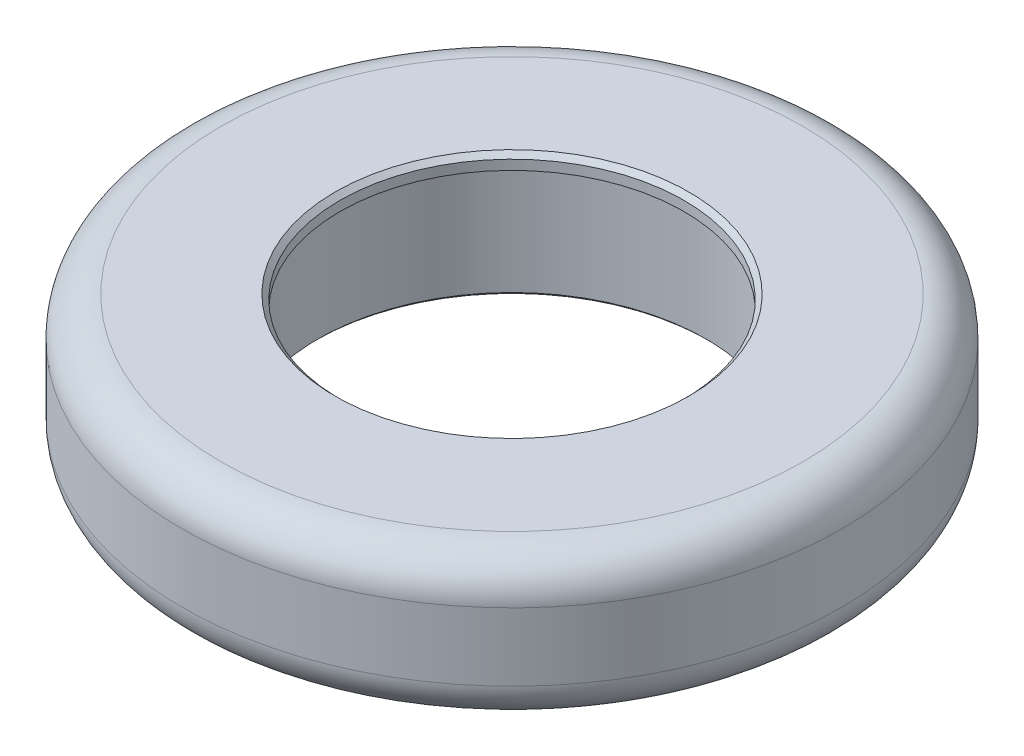
ISO-10303-21;
HEADER;
FILE_DESCRIPTION(('STEP AP214'),'2;1');
FILE_NAME('part.step','',(''),(''),'','','');
FILE_SCHEMA(('AUTOMOTIVE_DESIGN { 1 0 10303 214 1 1 1 1 }'));
ENDSEC;
DATA;
#1=APPLICATION_CONTEXT('core data for automotive mechanical design processes');
#2=APPLICATION_PROTOCOL_DEFINITION('international standard','automotive_design',2000,#1);
#3=PRODUCT_CONTEXT('',#1,'mechanical');
#4=PRODUCT('Part','Part','',(#3));
#5=PRODUCT_RELATED_PRODUCT_CATEGORY('part','',(#4));
#6=PRODUCT_DEFINITION_FORMATION('','',#4);
#7=PRODUCT_DEFINITION_CONTEXT('part definition',#1,'design');
#8=PRODUCT_DEFINITION('design','',#6,#7);
#9=PRODUCT_DEFINITION_SHAPE('','',#8);
#10=(LENGTH_UNIT() NAMED_UNIT(*) SI_UNIT(.MILLI.,.METRE.));
#11=(NAMED_UNIT(*) PLANE_ANGLE_UNIT() SI_UNIT($,.RADIAN.));
#12=(NAMED_UNIT(*) SI_UNIT($,.STERADIAN.) SOLID_ANGLE_UNIT());
#13=UNCERTAINTY_MEASURE_WITH_UNIT(LENGTH_MEASURE(1.E-05),#10,'distance_accuracy_value','');
#14=(GEOMETRIC_REPRESENTATION_CONTEXT(3) GLOBAL_UNCERTAINTY_ASSIGNED_CONTEXT((#13)) GLOBAL_UNIT_ASSIGNED_CONTEXT((#10,
#11,#12)) REPRESENTATION_CONTEXT('',''));
#15=CARTESIAN_POINT('',(0.,0.,0.));
#16=DIRECTION('',(0.,0.,1.));
#17=DIRECTION('',(1.,0.,0.));
#18=AXIS2_PLACEMENT_3D('',#15,#16,#17);
#19=CARTESIAN_POINT('',(-17.75,-19.1656552052698,0.));
#20=DIRECTION('',(0.,1.,0.));
#21=DIRECTION('',(-1.,0.,0.));
#22=AXIS2_PLACEMENT_3D('',#19,#20,#21);
#23=PLANE('',#22);
#24=CARTESIAN_POINT('',(0.,-19.1656552052698,0.));
#25=DIRECTION('',(0.,1.,0.));
#26=DIRECTION('',(-1.,0.,0.));
#27=AXIS2_PLACEMENT_3D('',#24,#25,#26);
#28=CIRCLE('',#27,18.25);
#29=CARTESIAN_POINT('',(-18.25,-19.1656552052698,0.));
#30=VERTEX_POINT('',#29);
#31=EDGE_CURVE('E65',#30,#30,#28,.F.);
#32=ORIENTED_EDGE('',*,*,#31,.T.);
#33=EDGE_LOOP('',(#32));
#34=FACE_BOUND('',#33,.T.);
#35=CARTESIAN_POINT('',(0.,-19.1656552052698,0.));
#36=DIRECTION('',(0.,1.,0.));
#37=DIRECTION('',(-1.,0.,0.));
#38=AXIS2_PLACEMENT_3D('',#35,#36,#37);
#39=CIRCLE('',#38,30.);
#40=CARTESIAN_POINT('',(-30.,-19.1656552052698,0.));
#41=VERTEX_POINT('',#40);
#42=EDGE_CURVE('E80',#41,#41,#39,.T.);
#43=ORIENTED_EDGE('',*,*,#42,.T.);
#44=EDGE_LOOP('',(#43));
#45=FACE_BOUND('',#44,.T.);
#46=ADVANCED_FACE('F45',(#34,#45),#23,.T.);
#47=CARTESIAN_POINT('',(0.,44.1108985024959,0.));
#48=DIRECTION('',(0.,1.,0.));
#49=DIRECTION('',(-1.,0.,0.));
#50=AXIS2_PLACEMENT_3D('',#47,#48,#49);
#51=CYLINDRICAL_SURFACE('',#50,34.);
#52=CARTESIAN_POINT('',(0.,-23.1656552052698,0.));
#53=DIRECTION('',(0.,1.,0.));
#54=DIRECTION('',(-1.,0.,0.));
#55=AXIS2_PLACEMENT_3D('',#52,#53,#54);
#56=CIRCLE('',#55,34.);
#57=CARTESIAN_POINT('',(-34.,-23.1656552052698,0.));
#58=VERTEX_POINT('',#57);
#59=EDGE_CURVE('E74',#58,#58,#56,.F.);
#60=ORIENTED_EDGE('',*,*,#59,.T.);
#61=EDGE_LOOP('',(#60));
#62=FACE_BOUND('',#61,.T.);
#63=CARTESIAN_POINT('',(0.,-30.1656552052698,0.));
#64=DIRECTION('',(0.,-1.,0.));
#65=DIRECTION('',(1.,0.,0.));
#66=AXIS2_PLACEMENT_3D('',#63,#64,#65);
#67=CIRCLE('',#66,34.);
#68=CARTESIAN_POINT('',(34.,-30.1656552052698,0.));
#69=VERTEX_POINT('',#68);
#70=EDGE_CURVE('E77',#69,#69,#67,.F.);
#71=ORIENTED_EDGE('',*,*,#70,.T.);
#72=EDGE_LOOP('',(#71));
#73=FACE_BOUND('',#72,.T.);
#74=ADVANCED_FACE('F110',(#62,#73),#51,.T.);
#75=CARTESIAN_POINT('',(-34.,-34.1656552052698,0.));
#76=DIRECTION('',(0.,-1.,0.));
#77=DIRECTION('',(1.,0.,0.));
#78=AXIS2_PLACEMENT_3D('',#75,#76,#77);
#79=PLANE('',#78);
#80=CARTESIAN_POINT('',(0.,-34.1656552052698,0.));
#81=DIRECTION('',(0.,-1.,0.));
#82=DIRECTION('',(1.,0.,0.));
#83=AXIS2_PLACEMENT_3D('',#80,#81,#82);
#84=CIRCLE('',#83,30.);
#85=CARTESIAN_POINT('',(30.,-34.1656552052698,0.));
#86=VERTEX_POINT('',#85);
#87=EDGE_CURVE('E71',#86,#86,#84,.T.);
#88=ORIENTED_EDGE('',*,*,#87,.T.);
#89=EDGE_LOOP('',(#88));
#90=FACE_BOUND('',#89,.T.);
#91=CARTESIAN_POINT('',(0.,-34.1656552052698,0.));
#92=DIRECTION('',(0.,1.,0.));
#93=DIRECTION('',(-1.,0.,0.));
#94=AXIS2_PLACEMENT_3D('',#91,#92,#93);
#95=CIRCLE('',#94,23.25);
#96=CARTESIAN_POINT('',(-23.25,-34.1656552052698,0.));
#97=VERTEX_POINT('',#96);
#98=EDGE_CURVE('E83',#97,#97,#95,.T.);
#99=ORIENTED_EDGE('',*,*,#98,.T.);
#100=EDGE_LOOP('',(#99));
#101=FACE_BOUND('',#100,.T.);
#102=ADVANCED_FACE('F116',(#90,#101),#79,.T.);
#103=CARTESIAN_POINT('',(0.,-34.1656552052698,0.));
#104=DIRECTION('',(0.,-1.,0.));
#105=DIRECTION('',(1.,0.,0.));
#106=AXIS2_PLACEMENT_3D('',#103,#104,#105);
#107=CONICAL_SURFACE('',#106,23.25,0.960070362405684);
#108=CARTESIAN_POINT('',(0.,-33.4656552052698,0.));
#109=DIRECTION('',(0.,1.,0.));
#110=DIRECTION('',(-1.,0.,0.));
#111=AXIS2_PLACEMENT_3D('',#108,#109,#110);
#112=CIRCLE('',#111,22.25);
#113=CARTESIAN_POINT('',(-22.25,-33.4656552052698,0.));
#114=VERTEX_POINT('',#113);
#115=EDGE_CURVE('E86',#114,#114,#112,.T.);
#116=ORIENTED_EDGE('',*,*,#115,.T.);
#117=EDGE_LOOP('',(#116));
#118=FACE_BOUND('',#117,.T.);
#119=ORIENTED_EDGE('',*,*,#98,.F.);
#120=EDGE_LOOP('',(#119));
#121=FACE_BOUND('',#120,.T.);
#122=ADVANCED_FACE('F142',(#118,#121),#107,.F.);
#123=CARTESIAN_POINT('',(-22.25,-33.4656552052698,0.));
#124=DIRECTION('',(0.,-1.,0.));
#125=DIRECTION('',(1.,0.,0.));
#126=AXIS2_PLACEMENT_3D('',#123,#124,#125);
#127=PLANE('',#126);
#128=CARTESIAN_POINT('',(0.,-33.4656552052698,0.));
#129=DIRECTION('',(0.,-1.,0.));
#130=DIRECTION('',(1.,0.,0.));
#131=AXIS2_PLACEMENT_3D('',#128,#129,#130);
#132=CIRCLE('',#131,20.3);
#133=CARTESIAN_POINT('',(20.3,-33.4656552052698,0.));
#134=VERTEX_POINT('',#133);
#135=EDGE_CURVE('E60',#134,#134,#132,.F.);
#136=ORIENTED_EDGE('',*,*,#135,.T.);
#137=EDGE_LOOP('',(#136));
#138=FACE_BOUND('',#137,.T.);
#139=ORIENTED_EDGE('',*,*,#115,.F.);
#140=EDGE_LOOP('',(#139));
#141=FACE_BOUND('',#140,.T.);
#142=ADVANCED_FACE('F139',(#138,#141),#127,.T.);
#143=CARTESIAN_POINT('',(0.,44.1108985024959,0.));
#144=DIRECTION('',(0.,1.,0.));
#145=DIRECTION('',(-1.,0.,0.));
#146=AXIS2_PLACEMENT_3D('',#143,#144,#145);
#147=CYLINDRICAL_SURFACE('',#146,20.);
#148=CARTESIAN_POINT('',(0.,-21.4656552052698,0.));
#149=DIRECTION('',(0.,-1.,0.));
#150=DIRECTION('',(1.,0.,0.));
#151=AXIS2_PLACEMENT_3D('',#148,#149,#150);
#152=CIRCLE('',#151,20.);
#153=CARTESIAN_POINT('',(20.,-21.4656552052698,0.));
#154=VERTEX_POINT('',#153);
#155=EDGE_CURVE('E52',#154,#154,#152,.F.);
#156=ORIENTED_EDGE('',*,*,#155,.T.);
#157=EDGE_LOOP('',(#156));
#158=FACE_BOUND('',#157,.T.);
#159=CARTESIAN_POINT('',(0.,-33.1656552052698,0.));
#160=DIRECTION('',(0.,-1.,0.));
#161=DIRECTION('',(1.,0.,0.));
#162=AXIS2_PLACEMENT_3D('',#159,#160,#161);
#163=CIRCLE('',#162,20.);
#164=CARTESIAN_POINT('',(20.,-33.1656552052698,0.));
#165=VERTEX_POINT('',#164);
#166=EDGE_CURVE('E56',#165,#165,#163,.T.);
#167=ORIENTED_EDGE('',*,*,#166,.T.);
#168=EDGE_LOOP('',(#167));
#169=FACE_BOUND('',#168,.T.);
#170=ADVANCED_FACE('F107',(#158,#169),#147,.F.);
#171=CARTESIAN_POINT('',(-20.,-20.6656552052698,0.));
#172=DIRECTION('',(0.,-1.,0.));
#173=DIRECTION('',(1.,0.,0.));
#174=AXIS2_PLACEMENT_3D('',#171,#172,#173);
#175=PLANE('',#174);
#176=CARTESIAN_POINT('',(0.,-20.6656552052698,0.));
#177=DIRECTION('',(0.,-1.,0.));
#178=DIRECTION('',(1.,0.,0.));
#179=AXIS2_PLACEMENT_3D('',#176,#177,#178);
#180=CIRCLE('',#179,19.2);
#181=CARTESIAN_POINT('',(19.2,-20.6656552052698,0.));
#182=VERTEX_POINT('',#181);
#183=EDGE_CURVE('E12',#182,#182,#180,.T.);
#184=ORIENTED_EDGE('',*,*,#183,.T.);
#185=EDGE_LOOP('',(#184));
#186=FACE_BOUND('',#185,.T.);
#187=CARTESIAN_POINT('',(0.,-20.6656552052698,0.));
#188=DIRECTION('',(0.,1.,0.));
#189=DIRECTION('',(-1.,0.,0.));
#190=AXIS2_PLACEMENT_3D('',#187,#188,#189);
#191=CIRCLE('',#190,17.75);
#192=CARTESIAN_POINT('',(-17.75,-20.6656552052698,0.));
#193=VERTEX_POINT('',#192);
#194=EDGE_CURVE('E89',#193,#193,#191,.T.);
#195=ORIENTED_EDGE('',*,*,#194,.T.);
#196=EDGE_LOOP('',(#195));
#197=FACE_BOUND('',#196,.T.);
#198=ADVANCED_FACE('F93',(#186,#197),#175,.T.);
#199=CARTESIAN_POINT('',(0.,44.1108985024959,0.));
#200=DIRECTION('',(0.,1.,0.));
#201=DIRECTION('',(-1.,0.,0.));
#202=AXIS2_PLACEMENT_3D('',#199,#200,#201);
#203=CYLINDRICAL_SURFACE('',#202,17.75);
#204=CARTESIAN_POINT('',(0.,-19.6656552052698,0.));
#205=DIRECTION('',(0.,1.,0.));
#206=DIRECTION('',(-1.,0.,0.));
#207=AXIS2_PLACEMENT_3D('',#204,#205,#206);
#208=CIRCLE('',#207,17.75);
#209=CARTESIAN_POINT('',(-17.75,-19.6656552052698,0.));
#210=VERTEX_POINT('',#209);
#211=EDGE_CURVE('E68',#210,#210,#208,.T.);
#212=ORIENTED_EDGE('',*,*,#211,.T.);
#213=EDGE_LOOP('',(#212));
#214=FACE_BOUND('',#213,.T.);
#215=ORIENTED_EDGE('',*,*,#194,.F.);
#216=EDGE_LOOP('',(#215));
#217=FACE_BOUND('',#216,.T.);
#218=ADVANCED_FACE('F95',(#214,#217),#203,.F.);
#219=CARTESIAN_POINT('',(0.,-23.1656552052698,0.));
#220=DIRECTION('',(0.,1.,0.));
#221=DIRECTION('',(-1.,0.,0.));
#222=AXIS2_PLACEMENT_3D('',#219,#220,#221);
#223=TOROIDAL_SURFACE('',#222,30.,4.);
#224=ORIENTED_EDGE('',*,*,#59,.F.);
#225=EDGE_LOOP('',(#224));
#226=FACE_BOUND('',#225,.T.);
#227=ORIENTED_EDGE('',*,*,#42,.F.);
#228=EDGE_LOOP('',(#227));
#229=FACE_BOUND('',#228,.T.);
#230=ADVANCED_FACE('F97',(#226,#229),#223,.T.);
#231=CARTESIAN_POINT('',(0.,-30.1656552052698,0.));
#232=DIRECTION('',(0.,-1.,0.));
#233=DIRECTION('',(1.,0.,0.));
#234=AXIS2_PLACEMENT_3D('',#231,#232,#233);
#235=TOROIDAL_SURFACE('',#234,30.,4.);
#236=ORIENTED_EDGE('',*,*,#87,.F.);
#237=EDGE_LOOP('',(#236));
#238=FACE_BOUND('',#237,.T.);
#239=ORIENTED_EDGE('',*,*,#70,.F.);
#240=EDGE_LOOP('',(#239));
#241=FACE_BOUND('',#240,.T.);
#242=ADVANCED_FACE('F104',(#238,#241),#235,.T.);
#243=CARTESIAN_POINT('',(0.,-19.6656552052698,0.));
#244=DIRECTION('',(0.,1.,0.));
#245=DIRECTION('',(-1.,0.,0.));
#246=AXIS2_PLACEMENT_3D('',#243,#244,#245);
#247=CONICAL_SURFACE('',#246,17.75,0.785398163397445);
#248=ORIENTED_EDGE('',*,*,#31,.F.);
#249=EDGE_LOOP('',(#248));
#250=FACE_BOUND('',#249,.T.);
#251=ORIENTED_EDGE('',*,*,#211,.F.);
#252=EDGE_LOOP('',(#251));
#253=FACE_BOUND('',#252,.T.);
#254=ADVANCED_FACE('F124',(#250,#253),#247,.F.);
#255=CARTESIAN_POINT('',(0.,-33.4656552052698,0.));
#256=DIRECTION('',(0.,-1.,0.));
#257=DIRECTION('',(1.,0.,0.));
#258=AXIS2_PLACEMENT_3D('',#255,#256,#257);
#259=CONICAL_SURFACE('',#258,20.3,0.785398163397443);
#260=ORIENTED_EDGE('',*,*,#166,.F.);
#261=EDGE_LOOP('',(#260));
#262=FACE_BOUND('',#261,.T.);
#263=ORIENTED_EDGE('',*,*,#135,.F.);
#264=EDGE_LOOP('',(#263));
#265=FACE_BOUND('',#264,.T.);
#266=ADVANCED_FACE('F127',(#262,#265),#259,.F.);
#267=CARTESIAN_POINT('',(0.,-21.4656552052698,0.));
#268=DIRECTION('',(0.,-1.,0.));
#269=DIRECTION('',(1.,0.,0.));
#270=AXIS2_PLACEMENT_3D('',#267,#268,#269);
#271=TOROIDAL_SURFACE('',#270,19.2,0.8);
#272=ORIENTED_EDGE('',*,*,#183,.F.);
#273=EDGE_LOOP('',(#272));
#274=FACE_BOUND('',#273,.T.);
#275=ORIENTED_EDGE('',*,*,#155,.F.);
#276=EDGE_LOOP('',(#275));
#277=FACE_BOUND('',#276,.T.);
#278=ADVANCED_FACE('F47',(#274,#277),#271,.F.);
#279=CLOSED_SHELL('',(#46,#74,#102,#122,#142,#170,#198,#218,#230,#242,#254,#266,#278));
#280=MANIFOLD_SOLID_BREP('B2',#279);
#281=ADVANCED_BREP_SHAPE_REPRESENTATION('',(#18,#280),#14);
#282=SHAPE_DEFINITION_REPRESENTATION(#9,#281);
ENDSEC;
END-ISO-10303-21;
